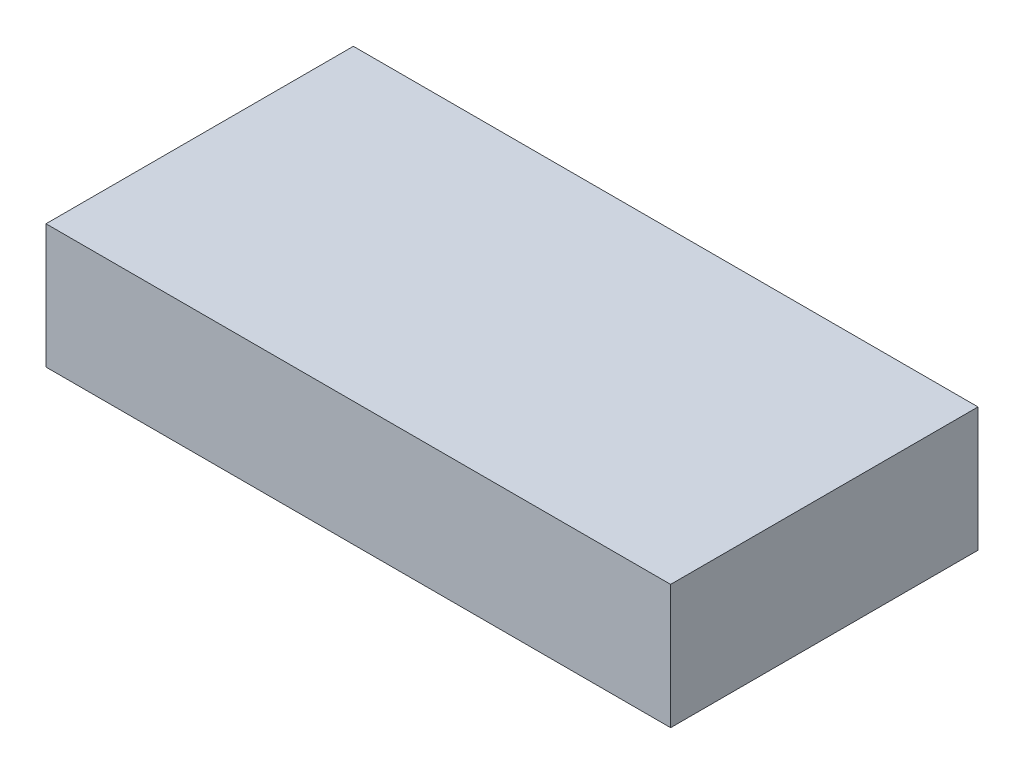
ISO-10303-21;
HEADER;
FILE_DESCRIPTION(('STEP AP214'),'2;1');
FILE_NAME('part.step','',(''),(''),'','','');
FILE_SCHEMA(('AUTOMOTIVE_DESIGN { 1 0 10303 214 1 1 1 1 }'));
ENDSEC;
DATA;
#1=APPLICATION_CONTEXT('core data for automotive mechanical design processes');
#2=APPLICATION_PROTOCOL_DEFINITION('international standard','automotive_design',2000,#1);
#3=PRODUCT_CONTEXT('',#1,'mechanical');
#4=PRODUCT('Part','Part','',(#3));
#5=PRODUCT_RELATED_PRODUCT_CATEGORY('part','',(#4));
#6=PRODUCT_DEFINITION_FORMATION('','',#4);
#7=PRODUCT_DEFINITION_CONTEXT('part definition',#1,'design');
#8=PRODUCT_DEFINITION('design','',#6,#7);
#9=PRODUCT_DEFINITION_SHAPE('','',#8);
#10=(LENGTH_UNIT() NAMED_UNIT(*) SI_UNIT(.MILLI.,.METRE.));
#11=(NAMED_UNIT(*) PLANE_ANGLE_UNIT() SI_UNIT($,.RADIAN.));
#12=(NAMED_UNIT(*) SI_UNIT($,.STERADIAN.) SOLID_ANGLE_UNIT());
#13=UNCERTAINTY_MEASURE_WITH_UNIT(LENGTH_MEASURE(1.E-05),#10,'distance_accuracy_value','');
#14=(GEOMETRIC_REPRESENTATION_CONTEXT(3) GLOBAL_UNCERTAINTY_ASSIGNED_CONTEXT((#13)) GLOBAL_UNIT_ASSIGNED_CONTEXT((#10,
#11,#12)) REPRESENTATION_CONTEXT('',''));
#15=CARTESIAN_POINT('',(0.,0.,0.));
#16=DIRECTION('',(0.,0.,1.));
#17=DIRECTION('',(1.,0.,0.));
#18=AXIS2_PLACEMENT_3D('',#15,#16,#17);
#19=CARTESIAN_POINT('',(7.925,-3.15,-3.9));
#20=DIRECTION('',(1.,0.,0.));
#21=DIRECTION('',(0.,0.,-1.));
#22=AXIS2_PLACEMENT_3D('',#19,#20,#21);
#23=PLANE('',#22);
#24=DIRECTION('',(0.,0.,-1.));
#25=VECTOR('',#24,1.);
#26=CARTESIAN_POINT('',(7.925,0.,-3.9));
#27=LINE('',#26,#25);
#28=CARTESIAN_POINT('',(7.925,0.,3.9));
#29=VERTEX_POINT('',#28);
#30=CARTESIAN_POINT('',(7.925,0.,-3.9));
#31=VERTEX_POINT('',#30);
#32=EDGE_CURVE('E115',#29,#31,#27,.T.);
#33=ORIENTED_EDGE('',*,*,#32,.F.);
#34=DIRECTION('',(0.,1.,0.));
#35=VECTOR('',#34,1.);
#36=CARTESIAN_POINT('',(7.925,-3.15,3.9));
#37=LINE('',#36,#35);
#38=CARTESIAN_POINT('',(7.925,-3.15,3.9));
#39=VERTEX_POINT('',#38);
#40=EDGE_CURVE('E11',#39,#29,#37,.T.);
#41=ORIENTED_EDGE('',*,*,#40,.F.);
#42=DIRECTION('',(0.,0.,-1.));
#43=VECTOR('',#42,1.);
#44=CARTESIAN_POINT('',(7.925,-3.15,-3.9));
#45=LINE('',#44,#43);
#46=CARTESIAN_POINT('',(7.925,-3.15,-3.9));
#47=VERTEX_POINT('',#46);
#48=EDGE_CURVE('E146',#39,#47,#45,.T.);
#49=ORIENTED_EDGE('',*,*,#48,.T.);
#50=DIRECTION('',(0.,1.,0.));
#51=VECTOR('',#50,1.);
#52=CARTESIAN_POINT('',(7.925,-3.15,-3.9));
#53=LINE('',#52,#51);
#54=EDGE_CURVE('E36',#47,#31,#53,.T.);
#55=ORIENTED_EDGE('',*,*,#54,.T.);
#56=EDGE_LOOP('',(#33,#41,#49,#55));
#57=FACE_BOUND('',#56,.T.);
#58=ADVANCED_FACE('F33',(#57),#23,.T.);
#59=CARTESIAN_POINT('',(-7.925,-3.15,3.9));
#60=DIRECTION('',(0.,0.,1.));
#61=DIRECTION('',(1.,0.,0.));
#62=AXIS2_PLACEMENT_3D('',#59,#60,#61);
#63=PLANE('',#62);
#64=DIRECTION('',(1.,0.,0.));
#65=VECTOR('',#64,1.);
#66=CARTESIAN_POINT('',(-7.925,0.,3.9));
#67=LINE('',#66,#65);
#68=CARTESIAN_POINT('',(-7.925,0.,3.9));
#69=VERTEX_POINT('',#68);
#70=EDGE_CURVE('E149',#69,#29,#67,.T.);
#71=ORIENTED_EDGE('',*,*,#70,.F.);
#72=DIRECTION('',(0.,1.,0.));
#73=VECTOR('',#72,1.);
#74=CARTESIAN_POINT('',(-7.925,-3.15,3.9));
#75=LINE('',#74,#73);
#76=CARTESIAN_POINT('',(-7.925,-3.15,3.9));
#77=VERTEX_POINT('',#76);
#78=EDGE_CURVE('E41',#77,#69,#75,.T.);
#79=ORIENTED_EDGE('',*,*,#78,.F.);
#80=DIRECTION('',(1.,0.,0.));
#81=VECTOR('',#80,1.);
#82=CARTESIAN_POINT('',(-7.925,-3.15,3.9));
#83=LINE('',#82,#81);
#84=EDGE_CURVE('E154',#77,#39,#83,.T.);
#85=ORIENTED_EDGE('',*,*,#84,.T.);
#86=ORIENTED_EDGE('',*,*,#40,.T.);
#87=EDGE_LOOP('',(#71,#79,#85,#86));
#88=FACE_BOUND('',#87,.T.);
#89=ADVANCED_FACE('F171',(#88),#63,.T.);
#90=CARTESIAN_POINT('',(-7.925,-3.15,-3.9));
#91=DIRECTION('',(-1.,0.,0.));
#92=DIRECTION('',(0.,0.,1.));
#93=AXIS2_PLACEMENT_3D('',#90,#91,#92);
#94=PLANE('',#93);
#95=DIRECTION('',(0.,0.,1.));
#96=VECTOR('',#95,1.);
#97=CARTESIAN_POINT('',(-7.925,0.,-3.9));
#98=LINE('',#97,#96);
#99=CARTESIAN_POINT('',(-7.925,0.,-3.9));
#100=VERTEX_POINT('',#99);
#101=EDGE_CURVE('E161',#100,#69,#98,.T.);
#102=ORIENTED_EDGE('',*,*,#101,.F.);
#103=DIRECTION('',(0.,1.,0.));
#104=VECTOR('',#103,1.);
#105=CARTESIAN_POINT('',(-7.925,-3.15,-3.9));
#106=LINE('',#105,#104);
#107=CARTESIAN_POINT('',(-7.925,-3.15,-3.9));
#108=VERTEX_POINT('',#107);
#109=EDGE_CURVE('E166',#108,#100,#106,.T.);
#110=ORIENTED_EDGE('',*,*,#109,.F.);
#111=DIRECTION('',(0.,0.,1.));
#112=VECTOR('',#111,1.);
#113=CARTESIAN_POINT('',(-7.925,-3.15,-3.9));
#114=LINE('',#113,#112);
#115=EDGE_CURVE('E151',#108,#77,#114,.T.);
#116=ORIENTED_EDGE('',*,*,#115,.T.);
#117=ORIENTED_EDGE('',*,*,#78,.T.);
#118=EDGE_LOOP('',(#102,#110,#116,#117));
#119=FACE_BOUND('',#118,.T.);
#120=ADVANCED_FACE('F175',(#119),#94,.T.);
#121=CARTESIAN_POINT('',(-7.925,-3.15,-3.9));
#122=DIRECTION('',(0.,0.,-1.));
#123=DIRECTION('',(-1.,0.,0.));
#124=AXIS2_PLACEMENT_3D('',#121,#122,#123);
#125=PLANE('',#124);
#126=DIRECTION('',(-1.,0.,0.));
#127=VECTOR('',#126,1.);
#128=CARTESIAN_POINT('',(-7.925,0.,-3.9));
#129=LINE('',#128,#127);
#130=EDGE_CURVE('E158',#31,#100,#129,.T.);
#131=ORIENTED_EDGE('',*,*,#130,.F.);
#132=ORIENTED_EDGE('',*,*,#54,.F.);
#133=DIRECTION('',(-1.,0.,0.));
#134=VECTOR('',#133,1.);
#135=CARTESIAN_POINT('',(-7.925,-3.15,-3.9));
#136=LINE('',#135,#134);
#137=EDGE_CURVE('E148',#47,#108,#136,.T.);
#138=ORIENTED_EDGE('',*,*,#137,.T.);
#139=ORIENTED_EDGE('',*,*,#109,.T.);
#140=EDGE_LOOP('',(#131,#132,#138,#139));
#141=FACE_BOUND('',#140,.T.);
#142=ADVANCED_FACE('F168',(#141),#125,.T.);
#143=CARTESIAN_POINT('',(0.,-3.15,0.));
#144=DIRECTION('',(0.,1.,0.));
#145=DIRECTION('',(0.,0.,1.));
#146=AXIS2_PLACEMENT_3D('',#143,#144,#145);
#147=PLANE('',#146);
#148=DIRECTION('',(1.,0.,0.));
#149=VECTOR('',#148,1.);
#150=CARTESIAN_POINT('',(0.,-3.15,2.4));
#151=LINE('',#150,#149);
#152=CARTESIAN_POINT('',(-6.425,-3.15,2.4));
#153=VERTEX_POINT('',#152);
#154=CARTESIAN_POINT('',(6.425,-3.15,2.4));
#155=VERTEX_POINT('',#154);
#156=EDGE_CURVE('E141',#153,#155,#151,.T.);
#157=ORIENTED_EDGE('',*,*,#156,.T.);
#158=DIRECTION('',(0.,0.,-1.));
#159=VECTOR('',#158,1.);
#160=CARTESIAN_POINT('',(6.425,-3.15,0.));
#161=LINE('',#160,#159);
#162=CARTESIAN_POINT('',(6.425,-3.15,-2.4));
#163=VERTEX_POINT('',#162);
#164=EDGE_CURVE('E110',#155,#163,#161,.T.);
#165=ORIENTED_EDGE('',*,*,#164,.T.);
#166=DIRECTION('',(-1.,0.,0.));
#167=VECTOR('',#166,1.);
#168=CARTESIAN_POINT('',(0.,-3.15,-2.4));
#169=LINE('',#168,#167);
#170=CARTESIAN_POINT('',(-6.425,-3.15,-2.4));
#171=VERTEX_POINT('',#170);
#172=EDGE_CURVE('E131',#163,#171,#169,.T.);
#173=ORIENTED_EDGE('',*,*,#172,.T.);
#174=DIRECTION('',(0.,0.,1.));
#175=VECTOR('',#174,1.);
#176=CARTESIAN_POINT('',(-6.425,-3.15,0.));
#177=LINE('',#176,#175);
#178=EDGE_CURVE('E49',#171,#153,#177,.T.);
#179=ORIENTED_EDGE('',*,*,#178,.T.);
#180=EDGE_LOOP('',(#157,#165,#173,#179));
#181=FACE_BOUND('',#180,.T.);
#182=ORIENTED_EDGE('',*,*,#48,.F.);
#183=ORIENTED_EDGE('',*,*,#84,.F.);
#184=ORIENTED_EDGE('',*,*,#115,.F.);
#185=ORIENTED_EDGE('',*,*,#137,.F.);
#186=EDGE_LOOP('',(#182,#183,#184,#185));
#187=FACE_BOUND('',#186,.T.);
#188=ADVANCED_FACE('F177',(#181,#187),#147,.F.);
#189=CARTESIAN_POINT('',(0.,0.,0.));
#190=DIRECTION('',(0.,1.,0.));
#191=DIRECTION('',(0.,0.,1.));
#192=AXIS2_PLACEMENT_3D('',#189,#190,#191);
#193=PLANE('',#192);
#194=ORIENTED_EDGE('',*,*,#32,.T.);
#195=ORIENTED_EDGE('',*,*,#130,.T.);
#196=ORIENTED_EDGE('',*,*,#101,.T.);
#197=ORIENTED_EDGE('',*,*,#70,.T.);
#198=EDGE_LOOP('',(#194,#195,#196,#197));
#199=FACE_BOUND('',#198,.T.);
#200=ADVANCED_FACE('F170',(#199),#193,.T.);
#201=CARTESIAN_POINT('',(6.425,-3.15,-3.9));
#202=DIRECTION('',(1.,0.,0.));
#203=DIRECTION('',(0.,0.,-1.));
#204=AXIS2_PLACEMENT_3D('',#201,#202,#203);
#205=PLANE('',#204);
#206=DIRECTION('',(0.,0.,-1.));
#207=VECTOR('',#206,1.);
#208=CARTESIAN_POINT('',(6.425,-1.5,0.));
#209=LINE('',#208,#207);
#210=CARTESIAN_POINT('',(6.425,-1.5,2.4));
#211=VERTEX_POINT('',#210);
#212=CARTESIAN_POINT('',(6.425,-1.5,-2.4));
#213=VERTEX_POINT('',#212);
#214=EDGE_CURVE('E108',#211,#213,#209,.T.);
#215=ORIENTED_EDGE('',*,*,#214,.T.);
#216=DIRECTION('',(0.,1.,0.));
#217=VECTOR('',#216,1.);
#218=CARTESIAN_POINT('',(6.425,-3.15,-2.4));
#219=LINE('',#218,#217);
#220=EDGE_CURVE('E136',#163,#213,#219,.T.);
#221=ORIENTED_EDGE('',*,*,#220,.F.);
#222=ORIENTED_EDGE('',*,*,#164,.F.);
#223=DIRECTION('',(0.,1.,0.));
#224=VECTOR('',#223,1.);
#225=CARTESIAN_POINT('',(6.425,-3.15,2.4));
#226=LINE('',#225,#224);
#227=EDGE_CURVE('E105',#155,#211,#226,.T.);
#228=ORIENTED_EDGE('',*,*,#227,.T.);
#229=EDGE_LOOP('',(#215,#221,#222,#228));
#230=FACE_BOUND('',#229,.T.);
#231=ADVANCED_FACE('F107',(#230),#205,.F.);
#232=CARTESIAN_POINT('',(-7.925,-3.15,2.4));
#233=DIRECTION('',(0.,0.,1.));
#234=DIRECTION('',(1.,0.,0.));
#235=AXIS2_PLACEMENT_3D('',#232,#233,#234);
#236=PLANE('',#235);
#237=DIRECTION('',(1.,0.,0.));
#238=VECTOR('',#237,1.);
#239=CARTESIAN_POINT('',(0.,-1.5,2.4));
#240=LINE('',#239,#238);
#241=CARTESIAN_POINT('',(-6.425,-1.5,2.4));
#242=VERTEX_POINT('',#241);
#243=EDGE_CURVE('E123',#242,#211,#240,.T.);
#244=ORIENTED_EDGE('',*,*,#243,.T.);
#245=ORIENTED_EDGE('',*,*,#227,.F.);
#246=ORIENTED_EDGE('',*,*,#156,.F.);
#247=DIRECTION('',(0.,1.,0.));
#248=VECTOR('',#247,1.);
#249=CARTESIAN_POINT('',(-6.425,-3.15,2.4));
#250=LINE('',#249,#248);
#251=EDGE_CURVE('E116',#153,#242,#250,.T.);
#252=ORIENTED_EDGE('',*,*,#251,.T.);
#253=EDGE_LOOP('',(#244,#245,#246,#252));
#254=FACE_BOUND('',#253,.T.);
#255=ADVANCED_FACE('F127',(#254),#236,.F.);
#256=CARTESIAN_POINT('',(-6.425,-3.15,-3.9));
#257=DIRECTION('',(-1.,0.,0.));
#258=DIRECTION('',(0.,0.,1.));
#259=AXIS2_PLACEMENT_3D('',#256,#257,#258);
#260=PLANE('',#259);
#261=DIRECTION('',(0.,0.,1.));
#262=VECTOR('',#261,1.);
#263=CARTESIAN_POINT('',(-6.425,-1.5,0.));
#264=LINE('',#263,#262);
#265=CARTESIAN_POINT('',(-6.425,-1.5,-2.4));
#266=VERTEX_POINT('',#265);
#267=EDGE_CURVE('E129',#266,#242,#264,.T.);
#268=ORIENTED_EDGE('',*,*,#267,.T.);
#269=ORIENTED_EDGE('',*,*,#251,.F.);
#270=ORIENTED_EDGE('',*,*,#178,.F.);
#271=DIRECTION('',(0.,1.,0.));
#272=VECTOR('',#271,1.);
#273=CARTESIAN_POINT('',(-6.425,-3.15,-2.4));
#274=LINE('',#273,#272);
#275=EDGE_CURVE('E137',#171,#266,#274,.T.);
#276=ORIENTED_EDGE('',*,*,#275,.T.);
#277=EDGE_LOOP('',(#268,#269,#270,#276));
#278=FACE_BOUND('',#277,.T.);
#279=ADVANCED_FACE('F229',(#278),#260,.F.);
#280=CARTESIAN_POINT('',(-7.925,-3.15,-2.4));
#281=DIRECTION('',(0.,0.,-1.));
#282=DIRECTION('',(-1.,0.,0.));
#283=AXIS2_PLACEMENT_3D('',#280,#281,#282);
#284=PLANE('',#283);
#285=DIRECTION('',(-1.,0.,0.));
#286=VECTOR('',#285,1.);
#287=CARTESIAN_POINT('',(0.,-1.5,-2.4));
#288=LINE('',#287,#286);
#289=EDGE_CURVE('E125',#213,#266,#288,.T.);
#290=ORIENTED_EDGE('',*,*,#289,.T.);
#291=ORIENTED_EDGE('',*,*,#275,.F.);
#292=ORIENTED_EDGE('',*,*,#172,.F.);
#293=ORIENTED_EDGE('',*,*,#220,.T.);
#294=EDGE_LOOP('',(#290,#291,#292,#293));
#295=FACE_BOUND('',#294,.T.);
#296=ADVANCED_FACE('F238',(#295),#284,.F.);
#297=CARTESIAN_POINT('',(0.,-1.5,0.));
#298=DIRECTION('',(0.,1.,0.));
#299=DIRECTION('',(0.,0.,1.));
#300=AXIS2_PLACEMENT_3D('',#297,#298,#299);
#301=PLANE('',#300);
#302=ORIENTED_EDGE('',*,*,#214,.F.);
#303=ORIENTED_EDGE('',*,*,#243,.F.);
#304=ORIENTED_EDGE('',*,*,#267,.F.);
#305=ORIENTED_EDGE('',*,*,#289,.F.);
#306=EDGE_LOOP('',(#302,#303,#304,#305));
#307=FACE_BOUND('',#306,.T.);
#308=ADVANCED_FACE('F121',(#307),#301,.F.);
#309=CLOSED_SHELL('',(#58,#89,#120,#142,#188,#200,#231,#255,#279,#296,#308));
#310=MANIFOLD_SOLID_BREP('B2',#309);
#311=ADVANCED_BREP_SHAPE_REPRESENTATION('',(#18,#310),#14);
#312=SHAPE_DEFINITION_REPRESENTATION(#9,#311);
ENDSEC;
END-ISO-10303-21;
